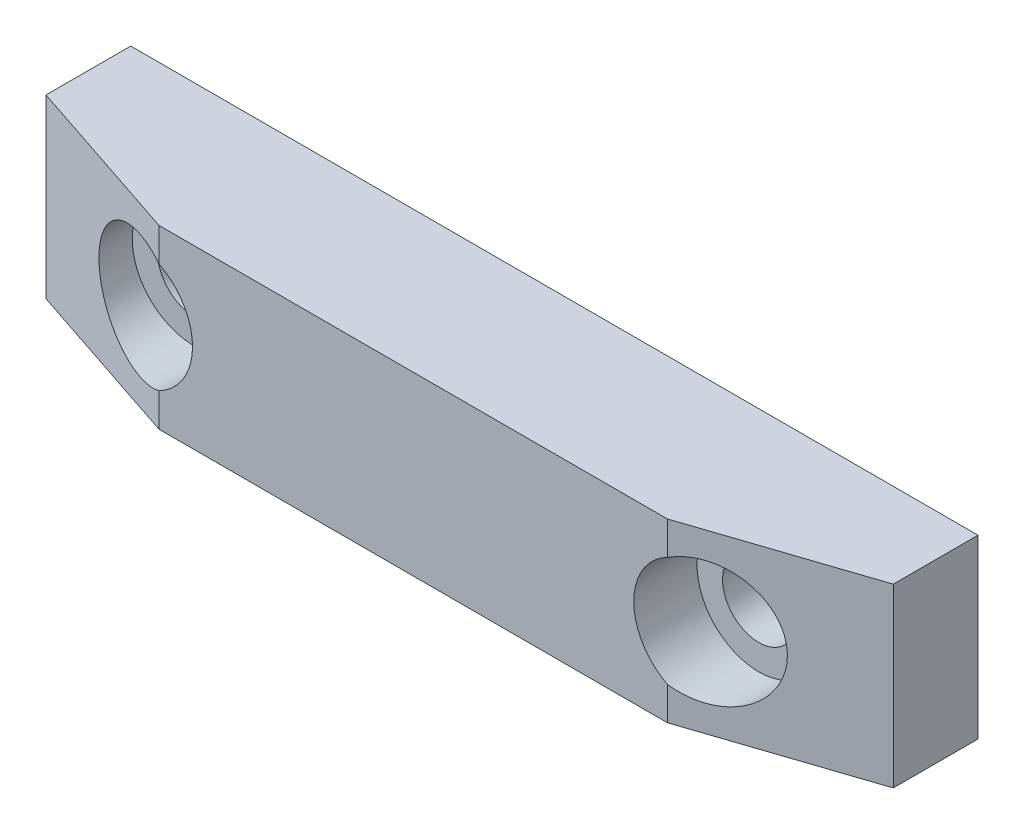
ISO-10303-21;
HEADER;
FILE_DESCRIPTION(('STEP AP214'),'2;1');
FILE_NAME('part.step','',(''),(''),'','','');
FILE_SCHEMA(('AUTOMOTIVE_DESIGN { 1 0 10303 214 1 1 1 1 }'));
ENDSEC;
DATA;
#1=APPLICATION_CONTEXT('core data for automotive mechanical design processes');
#2=APPLICATION_PROTOCOL_DEFINITION('international standard','automotive_design',2000,#1);
#3=PRODUCT_CONTEXT('',#1,'mechanical');
#4=PRODUCT('Part','Part','',(#3));
#5=PRODUCT_RELATED_PRODUCT_CATEGORY('part','',(#4));
#6=PRODUCT_DEFINITION_FORMATION('','',#4);
#7=PRODUCT_DEFINITION_CONTEXT('part definition',#1,'design');
#8=PRODUCT_DEFINITION('design','',#6,#7);
#9=PRODUCT_DEFINITION_SHAPE('','',#8);
#10=(LENGTH_UNIT() NAMED_UNIT(*) SI_UNIT(.MILLI.,.METRE.));
#11=(NAMED_UNIT(*) PLANE_ANGLE_UNIT() SI_UNIT($,.RADIAN.));
#12=(NAMED_UNIT(*) SI_UNIT($,.STERADIAN.) SOLID_ANGLE_UNIT());
#13=UNCERTAINTY_MEASURE_WITH_UNIT(LENGTH_MEASURE(1.E-05),#10,'distance_accuracy_value','');
#14=(GEOMETRIC_REPRESENTATION_CONTEXT(3) GLOBAL_UNCERTAINTY_ASSIGNED_CONTEXT((#13)) GLOBAL_UNIT_ASSIGNED_CONTEXT((#10,
#11,#12)) REPRESENTATION_CONTEXT('',''));
#15=CARTESIAN_POINT('',(0.,0.,0.));
#16=DIRECTION('',(0.,0.,1.));
#17=DIRECTION('',(1.,0.,0.));
#18=AXIS2_PLACEMENT_3D('',#15,#16,#17);
#19=CARTESIAN_POINT('',(0.,7.9375,0.));
#20=DIRECTION('',(1.,0.,0.));
#21=DIRECTION('',(0.,0.,-1.));
#22=AXIS2_PLACEMENT_3D('',#19,#20,#21);
#23=PLANE('',#22);
#24=DIRECTION('',(0.,0.,1.));
#25=VECTOR('',#24,1.);
#26=CARTESIAN_POINT('',(0.,0.,0.));
#27=LINE('',#26,#25);
#28=CARTESIAN_POINT('',(0.,0.,-6.35));
#29=VERTEX_POINT('',#28);
#30=CARTESIAN_POINT('',(0.,0.,-2.54));
#31=VERTEX_POINT('',#30);
#32=EDGE_CURVE('E139',#29,#31,#27,.T.);
#33=ORIENTED_EDGE('',*,*,#32,.T.);
#34=DIRECTION('',(0.,1.,0.));
#35=VECTOR('',#34,1.);
#36=CARTESIAN_POINT('',(0.,-4.7625,-2.54));
#37=LINE('',#36,#35);
#38=CARTESIAN_POINT('',(0.,7.9375,-2.54));
#39=VERTEX_POINT('',#38);
#40=EDGE_CURVE('E231',#31,#39,#37,.T.);
#41=ORIENTED_EDGE('',*,*,#40,.T.);
#42=DIRECTION('',(0.,0.,1.));
#43=VECTOR('',#42,1.);
#44=CARTESIAN_POINT('',(0.,7.9375,0.));
#45=LINE('',#44,#43);
#46=CARTESIAN_POINT('',(0.,7.9375,-6.35));
#47=VERTEX_POINT('',#46);
#48=EDGE_CURVE('E119',#47,#39,#45,.T.);
#49=ORIENTED_EDGE('',*,*,#48,.F.);
#50=DIRECTION('',(0.,-1.,0.));
#51=VECTOR('',#50,1.);
#52=CARTESIAN_POINT('',(0.,7.9375,-6.35));
#53=LINE('',#52,#51);
#54=EDGE_CURVE('E138',#47,#29,#53,.T.);
#55=ORIENTED_EDGE('',*,*,#54,.T.);
#56=EDGE_LOOP('',(#33,#41,#49,#55));
#57=FACE_BOUND('',#56,.T.);
#58=ADVANCED_FACE('F39',(#57),#23,.F.);
#59=CARTESIAN_POINT('',(0.,7.9375,0.));
#60=DIRECTION('',(0.,0.,-1.));
#61=DIRECTION('',(-1.,0.,0.));
#62=AXIS2_PLACEMENT_3D('',#59,#60,#61);
#63=PLANE('',#62);
#64=DIRECTION('',(1.,0.,0.));
#65=VECTOR('',#64,1.);
#66=CARTESIAN_POINT('',(0.,7.9375,0.));
#67=LINE('',#66,#65);
#68=CARTESIAN_POINT('',(7.62,7.9375,0.));
#69=VERTEX_POINT('',#68);
#70=CARTESIAN_POINT('',(30.48,7.9375,0.));
#71=VERTEX_POINT('',#70);
#72=EDGE_CURVE('E117',#69,#71,#67,.T.);
#73=ORIENTED_EDGE('',*,*,#72,.F.);
#74=DIRECTION('',(0.,1.,0.));
#75=VECTOR('',#74,1.);
#76=CARTESIAN_POINT('',(7.62,-4.7625,0.));
#77=LINE('',#76,#75);
#78=CARTESIAN_POINT('',(7.62,6.44030965689683,0.));
#79=VERTEX_POINT('',#78);
#80=EDGE_CURVE('E101',#79,#69,#77,.T.);
#81=ORIENTED_EDGE('',*,*,#80,.F.);
#82=CARTESIAN_POINT('',(6.35,3.96875,0.));
#83=DIRECTION('',(0.,0.,1.));
#84=DIRECTION('',(1.,0.,0.));
#85=AXIS2_PLACEMENT_3D('',#82,#83,#84);
#86=CIRCLE('',#85,2.77876);
#87=CARTESIAN_POINT('',(7.62,1.49719034310317,0.));
#88=VERTEX_POINT('',#87);
#89=EDGE_CURVE('E162',#88,#79,#86,.T.);
#90=ORIENTED_EDGE('',*,*,#89,.F.);
#91=CARTESIAN_POINT('',(7.62,0.,0.));
#92=VERTEX_POINT('',#91);
#93=EDGE_CURVE('E61',#92,#88,#77,.T.);
#94=ORIENTED_EDGE('',*,*,#93,.F.);
#95=DIRECTION('',(1.,0.,0.));
#96=VECTOR('',#95,1.);
#97=CARTESIAN_POINT('',(0.,0.,0.));
#98=LINE('',#97,#96);
#99=CARTESIAN_POINT('',(30.48,0.,0.));
#100=VERTEX_POINT('',#99);
#101=EDGE_CURVE('E143',#92,#100,#98,.T.);
#102=ORIENTED_EDGE('',*,*,#101,.T.);
#103=DIRECTION('',(0.,1.,0.));
#104=VECTOR('',#103,1.);
#105=CARTESIAN_POINT('',(30.48,-4.7625,0.));
#106=LINE('',#105,#104);
#107=CARTESIAN_POINT('',(30.48,1.49719034310316,0.));
#108=VERTEX_POINT('',#107);
#109=EDGE_CURVE('E121',#100,#108,#106,.T.);
#110=ORIENTED_EDGE('',*,*,#109,.T.);
#111=CARTESIAN_POINT('',(31.75,3.96875,0.));
#112=DIRECTION('',(0.,0.,1.));
#113=DIRECTION('',(1.,0.,0.));
#114=AXIS2_PLACEMENT_3D('',#111,#112,#113);
#115=CIRCLE('',#114,2.77876);
#116=CARTESIAN_POINT('',(30.48,6.44030965689684,0.));
#117=VERTEX_POINT('',#116);
#118=EDGE_CURVE('E184',#117,#108,#115,.T.);
#119=ORIENTED_EDGE('',*,*,#118,.F.);
#120=EDGE_CURVE('E54',#117,#71,#106,.T.);
#121=ORIENTED_EDGE('',*,*,#120,.T.);
#122=EDGE_LOOP('',(#73,#81,#90,#94,#102,#110,#119,#121));
#123=FACE_BOUND('',#122,.T.);
#124=ADVANCED_FACE('F123',(#123),#63,.F.);
#125=CARTESIAN_POINT('',(38.1,7.9375,0.));
#126=DIRECTION('',(-1.,0.,0.));
#127=DIRECTION('',(0.,0.,1.));
#128=AXIS2_PLACEMENT_3D('',#125,#126,#127);
#129=PLANE('',#128);
#130=DIRECTION('',(0.,0.,-1.));
#131=VECTOR('',#130,1.);
#132=CARTESIAN_POINT('',(38.1,7.9375,0.));
#133=LINE('',#132,#131);
#134=CARTESIAN_POINT('',(38.1,7.9375,-2.54));
#135=VERTEX_POINT('',#134);
#136=CARTESIAN_POINT('',(38.1,7.9375,-6.35));
#137=VERTEX_POINT('',#136);
#138=EDGE_CURVE('E126',#135,#137,#133,.T.);
#139=ORIENTED_EDGE('',*,*,#138,.F.);
#140=DIRECTION('',(0.,1.,0.));
#141=VECTOR('',#140,1.);
#142=CARTESIAN_POINT('',(38.1,-4.7625,-2.54));
#143=LINE('',#142,#141);
#144=CARTESIAN_POINT('',(38.1,0.,-2.54));
#145=VERTEX_POINT('',#144);
#146=EDGE_CURVE('E225',#145,#135,#143,.T.);
#147=ORIENTED_EDGE('',*,*,#146,.F.);
#148=DIRECTION('',(0.,0.,-1.));
#149=VECTOR('',#148,1.);
#150=CARTESIAN_POINT('',(38.1,0.,0.));
#151=LINE('',#150,#149);
#152=CARTESIAN_POINT('',(38.1,0.,-6.35));
#153=VERTEX_POINT('',#152);
#154=EDGE_CURVE('E148',#145,#153,#151,.T.);
#155=ORIENTED_EDGE('',*,*,#154,.T.);
#156=DIRECTION('',(0.,-1.,0.));
#157=VECTOR('',#156,1.);
#158=CARTESIAN_POINT('',(38.1,7.9375,-6.35));
#159=LINE('',#158,#157);
#160=EDGE_CURVE('E156',#137,#153,#159,.T.);
#161=ORIENTED_EDGE('',*,*,#160,.F.);
#162=EDGE_LOOP('',(#139,#147,#155,#161));
#163=FACE_BOUND('',#162,.T.);
#164=ADVANCED_FACE('F245',(#163),#129,.F.);
#165=CARTESIAN_POINT('',(0.,7.9375,-6.35));
#166=DIRECTION('',(0.,0.,1.));
#167=DIRECTION('',(1.,0.,0.));
#168=AXIS2_PLACEMENT_3D('',#165,#166,#167);
#169=PLANE('',#168);
#170=CARTESIAN_POINT('',(6.35,3.96875,-6.35));
#171=DIRECTION('',(0.,0.,1.));
#172=DIRECTION('',(1.,0.,0.));
#173=AXIS2_PLACEMENT_3D('',#170,#171,#172);
#174=CIRCLE('',#173,1.63195);
#175=CARTESIAN_POINT('',(7.98195,3.96875,-6.35));
#176=VERTEX_POINT('',#175);
#177=EDGE_CURVE('E180',#176,#176,#174,.T.);
#178=ORIENTED_EDGE('',*,*,#177,.T.);
#179=EDGE_LOOP('',(#178));
#180=FACE_BOUND('',#179,.T.);
#181=CARTESIAN_POINT('',(31.75,3.96875,-6.35));
#182=DIRECTION('',(0.,0.,1.));
#183=DIRECTION('',(1.,0.,0.));
#184=AXIS2_PLACEMENT_3D('',#181,#182,#183);
#185=CIRCLE('',#184,1.63195);
#186=CARTESIAN_POINT('',(33.38195,3.96875,-6.35));
#187=VERTEX_POINT('',#186);
#188=EDGE_CURVE('E144',#187,#187,#185,.T.);
#189=ORIENTED_EDGE('',*,*,#188,.T.);
#190=EDGE_LOOP('',(#189));
#191=FACE_BOUND('',#190,.T.);
#192=DIRECTION('',(-1.,0.,0.));
#193=VECTOR('',#192,1.);
#194=CARTESIAN_POINT('',(0.,0.,-6.35));
#195=LINE('',#194,#193);
#196=EDGE_CURVE('E132',#153,#29,#195,.T.);
#197=ORIENTED_EDGE('',*,*,#196,.T.);
#198=ORIENTED_EDGE('',*,*,#54,.F.);
#199=DIRECTION('',(-1.,0.,0.));
#200=VECTOR('',#199,1.);
#201=CARTESIAN_POINT('',(0.,7.9375,-6.35));
#202=LINE('',#201,#200);
#203=EDGE_CURVE('E130',#137,#47,#202,.T.);
#204=ORIENTED_EDGE('',*,*,#203,.F.);
#205=ORIENTED_EDGE('',*,*,#160,.T.);
#206=EDGE_LOOP('',(#197,#198,#204,#205));
#207=FACE_BOUND('',#206,.T.);
#208=ADVANCED_FACE('F199',(#180,#191,#207),#169,.F.);
#209=CARTESIAN_POINT('',(0.,7.9375,0.));
#210=DIRECTION('',(0.,-1.,0.));
#211=DIRECTION('',(0.,0.,-1.));
#212=AXIS2_PLACEMENT_3D('',#209,#210,#211);
#213=PLANE('',#212);
#214=ORIENTED_EDGE('',*,*,#48,.T.);
#215=DIRECTION('',(-0.948683298050514,0.,-0.316227766016838));
#216=VECTOR('',#215,1.);
#217=CARTESIAN_POINT('',(0.,7.9375,-2.54));
#218=LINE('',#217,#216);
#219=EDGE_CURVE('E104',#69,#39,#218,.T.);
#220=ORIENTED_EDGE('',*,*,#219,.F.);
#221=ORIENTED_EDGE('',*,*,#72,.T.);
#222=DIRECTION('',(-0.948683298050514,0.,0.316227766016838));
#223=VECTOR('',#222,1.);
#224=CARTESIAN_POINT('',(38.1,7.9375,-2.54));
#225=LINE('',#224,#223);
#226=EDGE_CURVE('E228',#135,#71,#225,.T.);
#227=ORIENTED_EDGE('',*,*,#226,.F.);
#228=ORIENTED_EDGE('',*,*,#138,.T.);
#229=ORIENTED_EDGE('',*,*,#203,.T.);
#230=EDGE_LOOP('',(#214,#220,#221,#227,#228,#229));
#231=FACE_BOUND('',#230,.T.);
#232=ADVANCED_FACE('F115',(#231),#213,.F.);
#233=CARTESIAN_POINT('',(0.,0.,0.));
#234=DIRECTION('',(0.,-1.,0.));
#235=DIRECTION('',(0.,0.,-1.));
#236=AXIS2_PLACEMENT_3D('',#233,#234,#235);
#237=PLANE('',#236);
#238=DIRECTION('',(0.948683298050514,0.,0.316227766016838));
#239=VECTOR('',#238,1.);
#240=CARTESIAN_POINT('',(0.762,0.,-2.286));
#241=LINE('',#240,#239);
#242=EDGE_CURVE('E173',#31,#92,#241,.T.);
#243=ORIENTED_EDGE('',*,*,#242,.F.);
#244=ORIENTED_EDGE('',*,*,#32,.F.);
#245=ORIENTED_EDGE('',*,*,#196,.F.);
#246=ORIENTED_EDGE('',*,*,#154,.F.);
#247=DIRECTION('',(0.948683298050514,0.,-0.316227766016838));
#248=VECTOR('',#247,1.);
#249=CARTESIAN_POINT('',(3.048,0.,9.144));
#250=LINE('',#249,#248);
#251=EDGE_CURVE('E166',#100,#145,#250,.T.);
#252=ORIENTED_EDGE('',*,*,#251,.F.);
#253=ORIENTED_EDGE('',*,*,#101,.F.);
#254=EDGE_LOOP('',(#243,#244,#245,#246,#252,#253));
#255=FACE_BOUND('',#254,.T.);
#256=ADVANCED_FACE('F206',(#255),#237,.T.);
#257=CARTESIAN_POINT('',(31.75,3.96875,0.));
#258=DIRECTION('',(0.,0.,1.));
#259=DIRECTION('',(1.,0.,0.));
#260=AXIS2_PLACEMENT_3D('',#257,#258,#259);
#261=CYLINDRICAL_SURFACE('',#260,1.63195);
#262=ORIENTED_EDGE('',*,*,#188,.F.);
#263=EDGE_LOOP('',(#262));
#264=FACE_BOUND('',#263,.T.);
#265=CARTESIAN_POINT('',(31.75,3.96875,-2.8448));
#266=DIRECTION('',(0.,0.,1.));
#267=DIRECTION('',(1.,0.,0.));
#268=AXIS2_PLACEMENT_3D('',#265,#266,#267);
#269=CIRCLE('',#268,1.63195);
#270=CARTESIAN_POINT('',(33.38195,3.96875,-2.8448));
#271=VERTEX_POINT('',#270);
#272=EDGE_CURVE('E192',#271,#271,#269,.T.);
#273=ORIENTED_EDGE('',*,*,#272,.T.);
#274=EDGE_LOOP('',(#273));
#275=FACE_BOUND('',#274,.T.);
#276=ADVANCED_FACE('F202',(#264,#275),#261,.F.);
#277=CARTESIAN_POINT('',(33.38195,3.96875,-2.8448));
#278=DIRECTION('',(0.,0.,-1.));
#279=DIRECTION('',(-1.,0.,0.));
#280=AXIS2_PLACEMENT_3D('',#277,#278,#279);
#281=PLANE('',#280);
#282=ORIENTED_EDGE('',*,*,#272,.F.);
#283=EDGE_LOOP('',(#282));
#284=FACE_BOUND('',#283,.T.);
#285=CARTESIAN_POINT('',(31.75,3.96875,-2.8448));
#286=DIRECTION('',(0.,0.,1.));
#287=DIRECTION('',(1.,0.,0.));
#288=AXIS2_PLACEMENT_3D('',#285,#286,#287);
#289=CIRCLE('',#288,2.77876);
#290=CARTESIAN_POINT('',(34.52876,3.96875,-2.8448));
#291=VERTEX_POINT('',#290);
#292=EDGE_CURVE('E188',#291,#291,#289,.T.);
#293=ORIENTED_EDGE('',*,*,#292,.T.);
#294=EDGE_LOOP('',(#293));
#295=FACE_BOUND('',#294,.T.);
#296=ADVANCED_FACE('F205',(#284,#295),#281,.F.);
#297=CARTESIAN_POINT('',(31.75,3.96875,0.));
#298=DIRECTION('',(0.,0.,1.));
#299=DIRECTION('',(1.,0.,0.));
#300=AXIS2_PLACEMENT_3D('',#297,#298,#299);
#301=CYLINDRICAL_SURFACE('',#300,2.77876);
#302=ORIENTED_EDGE('',*,*,#292,.F.);
#303=EDGE_LOOP('',(#302));
#304=FACE_BOUND('',#303,.T.);
#305=ORIENTED_EDGE('',*,*,#118,.T.);
#306=CARTESIAN_POINT('',(31.75,3.96875,-0.423333333333332));
#307=DIRECTION('',(-0.316227766016838,0.,-0.948683298050514));
#308=DIRECTION('',(-0.948683298050514,0.,0.316227766016838));
#309=AXIS2_PLACEMENT_3D('',#306,#307,#308);
#310=ELLIPSE('',#309,2.92907022365649,2.77876);
#311=EDGE_CURVE('E11',#108,#117,#310,.F.);
#312=ORIENTED_EDGE('',*,*,#311,.T.);
#313=EDGE_LOOP('',(#305,#312));
#314=FACE_BOUND('',#313,.T.);
#315=ADVANCED_FACE('F212',(#304,#314),#301,.F.);
#316=CARTESIAN_POINT('',(6.35,3.96875,0.));
#317=DIRECTION('',(0.,0.,1.));
#318=DIRECTION('',(1.,0.,0.));
#319=AXIS2_PLACEMENT_3D('',#316,#317,#318);
#320=CYLINDRICAL_SURFACE('',#319,1.63195);
#321=ORIENTED_EDGE('',*,*,#177,.F.);
#322=EDGE_LOOP('',(#321));
#323=FACE_BOUND('',#322,.T.);
#324=CARTESIAN_POINT('',(6.35,3.96875,-2.8448));
#325=DIRECTION('',(0.,0.,1.));
#326=DIRECTION('',(1.,0.,0.));
#327=AXIS2_PLACEMENT_3D('',#324,#325,#326);
#328=CIRCLE('',#327,1.63195);
#329=CARTESIAN_POINT('',(7.98195,3.96875,-2.8448));
#330=VERTEX_POINT('',#329);
#331=EDGE_CURVE('E171',#330,#330,#328,.T.);
#332=ORIENTED_EDGE('',*,*,#331,.T.);
#333=EDGE_LOOP('',(#332));
#334=FACE_BOUND('',#333,.T.);
#335=ADVANCED_FACE('F218',(#323,#334),#320,.F.);
#336=CARTESIAN_POINT('',(7.98195,3.96875,-2.8448));
#337=DIRECTION('',(0.,0.,-1.));
#338=DIRECTION('',(-1.,0.,0.));
#339=AXIS2_PLACEMENT_3D('',#336,#337,#338);
#340=PLANE('',#339);
#341=ORIENTED_EDGE('',*,*,#331,.F.);
#342=EDGE_LOOP('',(#341));
#343=FACE_BOUND('',#342,.T.);
#344=CARTESIAN_POINT('',(6.35,3.96875,-2.8448));
#345=DIRECTION('',(0.,0.,1.));
#346=DIRECTION('',(1.,0.,0.));
#347=AXIS2_PLACEMENT_3D('',#344,#345,#346);
#348=CIRCLE('',#347,2.77876);
#349=CARTESIAN_POINT('',(9.12876,3.96875,-2.8448));
#350=VERTEX_POINT('',#349);
#351=EDGE_CURVE('E165',#350,#350,#348,.T.);
#352=ORIENTED_EDGE('',*,*,#351,.T.);
#353=EDGE_LOOP('',(#352));
#354=FACE_BOUND('',#353,.T.);
#355=ADVANCED_FACE('F303',(#343,#354),#340,.F.);
#356=CARTESIAN_POINT('',(6.35,3.96875,0.));
#357=DIRECTION('',(0.,0.,1.));
#358=DIRECTION('',(1.,0.,0.));
#359=AXIS2_PLACEMENT_3D('',#356,#357,#358);
#360=CYLINDRICAL_SURFACE('',#359,2.77876);
#361=ORIENTED_EDGE('',*,*,#351,.F.);
#362=EDGE_LOOP('',(#361));
#363=FACE_BOUND('',#362,.T.);
#364=ORIENTED_EDGE('',*,*,#89,.T.);
#365=CARTESIAN_POINT('',(6.35,3.96875,-0.423333333333333));
#366=DIRECTION('',(0.316227766016838,0.,-0.948683298050514));
#367=DIRECTION('',(0.948683298050514,0.,0.316227766016838));
#368=AXIS2_PLACEMENT_3D('',#365,#366,#367);
#369=ELLIPSE('',#368,2.9290702236565,2.77876);
#370=EDGE_CURVE('E47',#79,#88,#369,.F.);
#371=ORIENTED_EDGE('',*,*,#370,.T.);
#372=EDGE_LOOP('',(#364,#371));
#373=FACE_BOUND('',#372,.T.);
#374=ADVANCED_FACE('F161',(#363,#373),#360,.F.);
#375=CARTESIAN_POINT('',(0.,-4.7625,-2.54));
#376=DIRECTION('',(0.316227766016838,0.,-0.948683298050514));
#377=DIRECTION('',(-0.948683298050514,0.,-0.316227766016838));
#378=AXIS2_PLACEMENT_3D('',#375,#376,#377);
#379=PLANE('',#378);
#380=ORIENTED_EDGE('',*,*,#242,.T.);
#381=ORIENTED_EDGE('',*,*,#93,.T.);
#382=ORIENTED_EDGE('',*,*,#370,.F.);
#383=ORIENTED_EDGE('',*,*,#80,.T.);
#384=ORIENTED_EDGE('',*,*,#219,.T.);
#385=ORIENTED_EDGE('',*,*,#40,.F.);
#386=EDGE_LOOP('',(#380,#381,#382,#383,#384,#385));
#387=FACE_BOUND('',#386,.T.);
#388=ADVANCED_FACE('F103',(#387),#379,.F.);
#389=CARTESIAN_POINT('',(38.1,-4.7625,-2.54));
#390=DIRECTION('',(-0.316227766016838,0.,-0.948683298050514));
#391=DIRECTION('',(-0.948683298050514,0.,0.316227766016838));
#392=AXIS2_PLACEMENT_3D('',#389,#390,#391);
#393=PLANE('',#392);
#394=ORIENTED_EDGE('',*,*,#251,.T.);
#395=ORIENTED_EDGE('',*,*,#146,.T.);
#396=ORIENTED_EDGE('',*,*,#226,.T.);
#397=ORIENTED_EDGE('',*,*,#120,.F.);
#398=ORIENTED_EDGE('',*,*,#311,.F.);
#399=ORIENTED_EDGE('',*,*,#109,.F.);
#400=EDGE_LOOP('',(#394,#395,#396,#397,#398,#399));
#401=FACE_BOUND('',#400,.T.);
#402=ADVANCED_FACE('F242',(#401),#393,.F.);
#403=CLOSED_SHELL('',(#58,#124,#164,#208,#232,#256,#276,#296,#315,#335,#355,#374,#388,#402));
#404=MANIFOLD_SOLID_BREP('B2',#403);
#405=ADVANCED_BREP_SHAPE_REPRESENTATION('',(#18,#404),#14);
#406=SHAPE_DEFINITION_REPRESENTATION(#9,#405);
ENDSEC;
END-ISO-10303-21;
